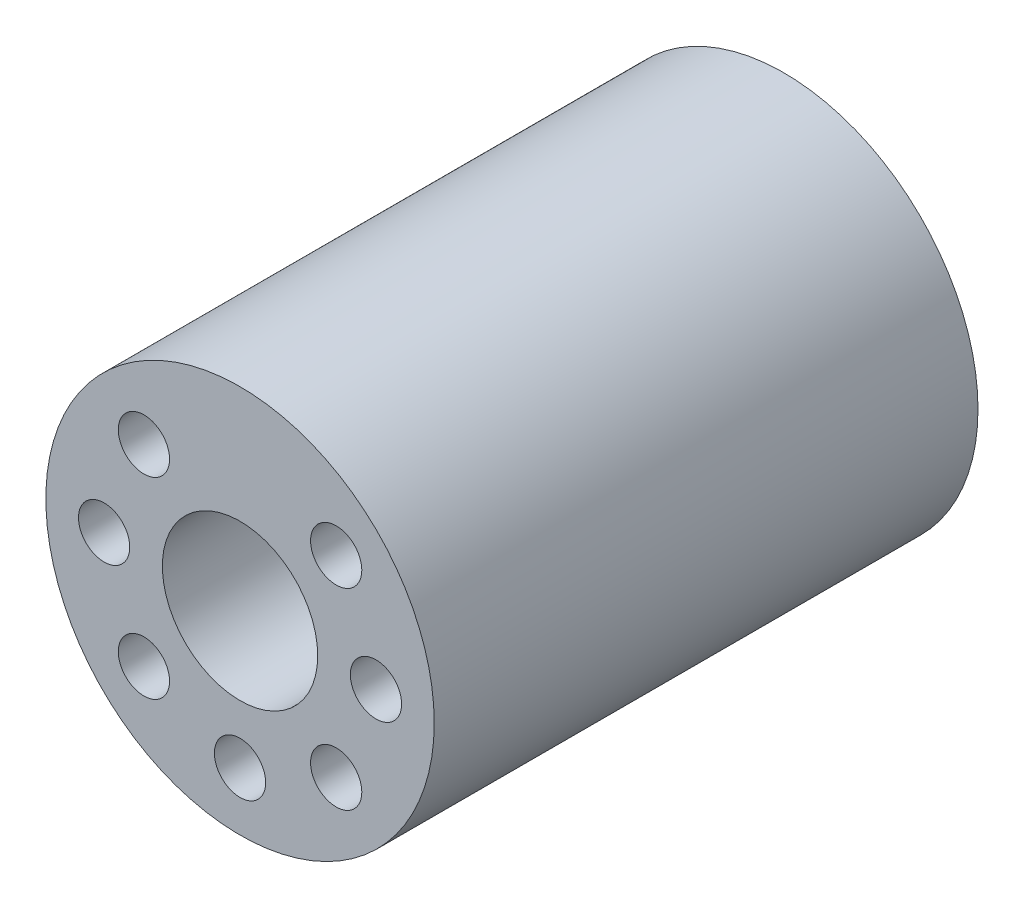
ISO-10303-21;
HEADER;
FILE_DESCRIPTION(('STEP AP214'),'2;1');
FILE_NAME('part.step','',(''),(''),'','','');
FILE_SCHEMA(('AUTOMOTIVE_DESIGN { 1 0 10303 214 1 1 1 1 }'));
ENDSEC;
DATA;
#1=APPLICATION_CONTEXT('core data for automotive mechanical design processes');
#2=APPLICATION_PROTOCOL_DEFINITION('international standard','automotive_design',2000,#1);
#3=PRODUCT_CONTEXT('',#1,'mechanical');
#4=PRODUCT('Part','Part','',(#3));
#5=PRODUCT_RELATED_PRODUCT_CATEGORY('part','',(#4));
#6=PRODUCT_DEFINITION_FORMATION('','',#4);
#7=PRODUCT_DEFINITION_CONTEXT('part definition',#1,'design');
#8=PRODUCT_DEFINITION('design','',#6,#7);
#9=PRODUCT_DEFINITION_SHAPE('','',#8);
#10=(LENGTH_UNIT() NAMED_UNIT(*) SI_UNIT(.MILLI.,.METRE.));
#11=(NAMED_UNIT(*) PLANE_ANGLE_UNIT() SI_UNIT($,.RADIAN.));
#12=(NAMED_UNIT(*) SI_UNIT($,.STERADIAN.) SOLID_ANGLE_UNIT());
#13=UNCERTAINTY_MEASURE_WITH_UNIT(LENGTH_MEASURE(1.E-05),#10,'distance_accuracy_value','');
#14=(GEOMETRIC_REPRESENTATION_CONTEXT(3) GLOBAL_UNCERTAINTY_ASSIGNED_CONTEXT((#13)) GLOBAL_UNIT_ASSIGNED_CONTEXT((#10,
#11,#12)) REPRESENTATION_CONTEXT('',''));
#15=CARTESIAN_POINT('',(0.,0.,0.));
#16=DIRECTION('',(0.,0.,1.));
#17=DIRECTION('',(1.,0.,0.));
#18=AXIS2_PLACEMENT_3D('',#15,#16,#17);
#19=CARTESIAN_POINT('',(0.,0.,70.));
#20=DIRECTION('',(0.,0.,1.));
#21=DIRECTION('',(1.,0.,0.));
#22=AXIS2_PLACEMENT_3D('',#19,#20,#21);
#23=PLANE('',#22);
#24=CARTESIAN_POINT('',(17.5,0.,70.));
#25=DIRECTION('',(0.,0.,1.));
#26=DIRECTION('',(1.,0.,0.));
#27=AXIS2_PLACEMENT_3D('',#24,#25,#26);
#28=CIRCLE('',#27,3.3);
#29=CARTESIAN_POINT('',(20.8,0.,70.));
#30=VERTEX_POINT('',#29);
#31=EDGE_CURVE('E59',#30,#30,#28,.T.);
#32=ORIENTED_EDGE('',*,*,#31,.F.);
#33=EDGE_LOOP('',(#32));
#34=FACE_BOUND('',#33,.T.);
#35=CARTESIAN_POINT('',(12.3743686707645,-12.3743686707646,70.));
#36=DIRECTION('',(0.,0.,1.));
#37=DIRECTION('',(1.,0.,0.));
#38=AXIS2_PLACEMENT_3D('',#35,#36,#37);
#39=CIRCLE('',#38,3.3);
#40=CARTESIAN_POINT('',(15.6743686707645,-12.3743686707646,70.));
#41=VERTEX_POINT('',#40);
#42=EDGE_CURVE('E78',#41,#41,#39,.T.);
#43=ORIENTED_EDGE('',*,*,#42,.F.);
#44=EDGE_LOOP('',(#43));
#45=FACE_BOUND('',#44,.T.);
#46=CARTESIAN_POINT('',(-1.2220184685951E-13,-17.5,70.));
#47=DIRECTION('',(0.,0.,1.));
#48=DIRECTION('',(1.,0.,0.));
#49=AXIS2_PLACEMENT_3D('',#46,#47,#48);
#50=CIRCLE('',#49,3.3);
#51=CARTESIAN_POINT('',(3.29999999999988,-17.5,70.));
#52=VERTEX_POINT('',#51);
#53=EDGE_CURVE('E72',#52,#52,#50,.T.);
#54=ORIENTED_EDGE('',*,*,#53,.F.);
#55=EDGE_LOOP('',(#54));
#56=FACE_BOUND('',#55,.T.);
#57=CARTESIAN_POINT('',(-12.3743686707647,-12.3743686707645,70.));
#58=DIRECTION('',(0.,0.,1.));
#59=DIRECTION('',(1.,0.,0.));
#60=AXIS2_PLACEMENT_3D('',#57,#58,#59);
#61=CIRCLE('',#60,3.3);
#62=CARTESIAN_POINT('',(-9.07436867076469,-12.3743686707645,70.));
#63=VERTEX_POINT('',#62);
#64=EDGE_CURVE('E65',#63,#63,#61,.T.);
#65=ORIENTED_EDGE('',*,*,#64,.F.);
#66=EDGE_LOOP('',(#65));
#67=FACE_BOUND('',#66,.T.);
#68=CARTESIAN_POINT('',(-17.5,1.83302770289264E-13,70.));
#69=DIRECTION('',(0.,0.,1.));
#70=DIRECTION('',(1.,0.,0.));
#71=AXIS2_PLACEMENT_3D('',#68,#69,#70);
#72=CIRCLE('',#71,3.3);
#73=CARTESIAN_POINT('',(-14.2,1.83302770289264E-13,70.));
#74=VERTEX_POINT('',#73);
#75=EDGE_CURVE('E66',#74,#74,#72,.T.);
#76=ORIENTED_EDGE('',*,*,#75,.F.);
#77=EDGE_LOOP('',(#76));
#78=FACE_BOUND('',#77,.T.);
#79=CARTESIAN_POINT('',(-12.3743686707644,12.3743686707647,70.));
#80=DIRECTION('',(0.,0.,1.));
#81=DIRECTION('',(1.,0.,0.));
#82=AXIS2_PLACEMENT_3D('',#79,#80,#81);
#83=CIRCLE('',#82,3.3);
#84=CARTESIAN_POINT('',(-9.07436867076443,12.3743686707647,70.));
#85=VERTEX_POINT('',#84);
#86=EDGE_CURVE('E89',#85,#85,#83,.T.);
#87=ORIENTED_EDGE('',*,*,#86,.F.);
#88=EDGE_LOOP('',(#87));
#89=FACE_BOUND('',#88,.T.);
#90=CARTESIAN_POINT('',(12.3743686707646,12.3743686707646,70.));
#91=DIRECTION('',(0.,0.,1.));
#92=DIRECTION('',(1.,0.,0.));
#93=AXIS2_PLACEMENT_3D('',#90,#91,#92);
#94=CIRCLE('',#93,3.3);
#95=CARTESIAN_POINT('',(15.6743686707646,12.3743686707646,70.));
#96=VERTEX_POINT('',#95);
#97=EDGE_CURVE('E56',#96,#96,#94,.T.);
#98=ORIENTED_EDGE('',*,*,#97,.F.);
#99=EDGE_LOOP('',(#98));
#100=FACE_BOUND('',#99,.T.);
#101=CARTESIAN_POINT('',(0.,0.,70.));
#102=DIRECTION('',(0.,0.,1.));
#103=DIRECTION('',(1.,0.,0.));
#104=AXIS2_PLACEMENT_3D('',#101,#102,#103);
#105=CIRCLE('',#104,25.);
#106=CARTESIAN_POINT('',(25.,0.,70.));
#107=VERTEX_POINT('',#106);
#108=EDGE_CURVE('E10',#107,#107,#105,.T.);
#109=ORIENTED_EDGE('',*,*,#108,.T.);
#110=EDGE_LOOP('',(#109));
#111=FACE_BOUND('',#110,.T.);
#112=CARTESIAN_POINT('',(0.,0.,70.));
#113=DIRECTION('',(0.,0.,1.));
#114=DIRECTION('',(1.,0.,0.));
#115=AXIS2_PLACEMENT_3D('',#112,#113,#114);
#116=CIRCLE('',#115,10.);
#117=CARTESIAN_POINT('',(10.,0.,70.));
#118=VERTEX_POINT('',#117);
#119=EDGE_CURVE('E48',#118,#118,#116,.T.);
#120=ORIENTED_EDGE('',*,*,#119,.F.);
#121=EDGE_LOOP('',(#120));
#122=FACE_BOUND('',#121,.T.);
#123=ADVANCED_FACE('F37',(#34,#45,#56,#67,#78,#89,#100,#111,#122),#23,.T.);
#124=CARTESIAN_POINT('',(0.,0.,0.));
#125=DIRECTION('',(0.,0.,1.));
#126=DIRECTION('',(1.,0.,0.));
#127=AXIS2_PLACEMENT_3D('',#124,#125,#126);
#128=PLANE('',#127);
#129=CARTESIAN_POINT('',(12.3743686707644,12.3743686707647,0.));
#130=DIRECTION('',(0.,0.,-1.));
#131=DIRECTION('',(-1.,0.,0.));
#132=AXIS2_PLACEMENT_3D('',#129,#130,#131);
#133=CIRCLE('',#132,3.3);
#134=CARTESIAN_POINT('',(9.07436867076443,12.3743686707647,0.));
#135=VERTEX_POINT('',#134);
#136=EDGE_CURVE('E107',#135,#135,#133,.T.);
#137=ORIENTED_EDGE('',*,*,#136,.F.);
#138=EDGE_LOOP('',(#137));
#139=FACE_BOUND('',#138,.T.);
#140=CARTESIAN_POINT('',(17.5,1.83302770289264E-13,0.));
#141=DIRECTION('',(0.,0.,-1.));
#142=DIRECTION('',(-1.,0.,0.));
#143=AXIS2_PLACEMENT_3D('',#140,#141,#142);
#144=CIRCLE('',#143,3.3);
#145=CARTESIAN_POINT('',(14.2,1.83302770289264E-13,0.));
#146=VERTEX_POINT('',#145);
#147=EDGE_CURVE('E113',#146,#146,#144,.T.);
#148=ORIENTED_EDGE('',*,*,#147,.F.);
#149=EDGE_LOOP('',(#148));
#150=FACE_BOUND('',#149,.T.);
#151=CARTESIAN_POINT('',(12.3743686707647,-12.3743686707645,0.));
#152=DIRECTION('',(0.,0.,-1.));
#153=DIRECTION('',(-1.,0.,0.));
#154=AXIS2_PLACEMENT_3D('',#151,#152,#153);
#155=CIRCLE('',#154,3.3);
#156=CARTESIAN_POINT('',(9.07436867076469,-12.3743686707645,0.));
#157=VERTEX_POINT('',#156);
#158=EDGE_CURVE('E119',#157,#157,#155,.T.);
#159=ORIENTED_EDGE('',*,*,#158,.F.);
#160=EDGE_LOOP('',(#159));
#161=FACE_BOUND('',#160,.T.);
#162=CARTESIAN_POINT('',(1.2220184685951E-13,-17.5,0.));
#163=DIRECTION('',(0.,0.,-1.));
#164=DIRECTION('',(-1.,0.,0.));
#165=AXIS2_PLACEMENT_3D('',#162,#163,#164);
#166=CIRCLE('',#165,3.3);
#167=CARTESIAN_POINT('',(-3.29999999999988,-17.5,0.));
#168=VERTEX_POINT('',#167);
#169=EDGE_CURVE('E125',#168,#168,#166,.T.);
#170=ORIENTED_EDGE('',*,*,#169,.F.);
#171=EDGE_LOOP('',(#170));
#172=FACE_BOUND('',#171,.T.);
#173=CARTESIAN_POINT('',(-12.3743686707645,-12.3743686707646,0.));
#174=DIRECTION('',(0.,0.,-1.));
#175=DIRECTION('',(-1.,0.,0.));
#176=AXIS2_PLACEMENT_3D('',#173,#174,#175);
#177=CIRCLE('',#176,3.3);
#178=CARTESIAN_POINT('',(-15.6743686707645,-12.3743686707646,0.));
#179=VERTEX_POINT('',#178);
#180=EDGE_CURVE('E131',#179,#179,#177,.T.);
#181=ORIENTED_EDGE('',*,*,#180,.F.);
#182=EDGE_LOOP('',(#181));
#183=FACE_BOUND('',#182,.T.);
#184=CARTESIAN_POINT('',(-17.5,0.,0.));
#185=DIRECTION('',(0.,0.,-1.));
#186=DIRECTION('',(-1.,0.,0.));
#187=AXIS2_PLACEMENT_3D('',#184,#185,#186);
#188=CIRCLE('',#187,3.3);
#189=CARTESIAN_POINT('',(-20.8,0.,0.));
#190=VERTEX_POINT('',#189);
#191=EDGE_CURVE('E137',#190,#190,#188,.T.);
#192=ORIENTED_EDGE('',*,*,#191,.F.);
#193=EDGE_LOOP('',(#192));
#194=FACE_BOUND('',#193,.T.);
#195=CARTESIAN_POINT('',(-12.3743686707646,12.3743686707646,0.));
#196=DIRECTION('',(0.,0.,-1.));
#197=DIRECTION('',(-1.,0.,0.));
#198=AXIS2_PLACEMENT_3D('',#195,#196,#197);
#199=CIRCLE('',#198,3.3);
#200=CARTESIAN_POINT('',(-15.6743686707646,12.3743686707646,0.));
#201=VERTEX_POINT('',#200);
#202=EDGE_CURVE('E101',#201,#201,#199,.T.);
#203=ORIENTED_EDGE('',*,*,#202,.F.);
#204=EDGE_LOOP('',(#203));
#205=FACE_BOUND('',#204,.T.);
#206=CARTESIAN_POINT('',(0.,17.5,0.));
#207=DIRECTION('',(0.,0.,-1.));
#208=DIRECTION('',(-1.,0.,0.));
#209=AXIS2_PLACEMENT_3D('',#206,#207,#208);
#210=CIRCLE('',#209,3.3);
#211=CARTESIAN_POINT('',(-3.3,17.5,0.));
#212=VERTEX_POINT('',#211);
#213=EDGE_CURVE('E98',#212,#212,#210,.T.);
#214=ORIENTED_EDGE('',*,*,#213,.F.);
#215=EDGE_LOOP('',(#214));
#216=FACE_BOUND('',#215,.T.);
#217=CARTESIAN_POINT('',(0.,0.,0.));
#218=DIRECTION('',(0.,0.,1.));
#219=DIRECTION('',(1.,0.,0.));
#220=AXIS2_PLACEMENT_3D('',#217,#218,#219);
#221=CIRCLE('',#220,25.);
#222=CARTESIAN_POINT('',(25.,0.,0.));
#223=VERTEX_POINT('',#222);
#224=EDGE_CURVE('E41',#223,#223,#221,.T.);
#225=ORIENTED_EDGE('',*,*,#224,.F.);
#226=EDGE_LOOP('',(#225));
#227=FACE_BOUND('',#226,.T.);
#228=CARTESIAN_POINT('',(0.,0.,0.));
#229=DIRECTION('',(0.,0.,1.));
#230=DIRECTION('',(1.,0.,0.));
#231=AXIS2_PLACEMENT_3D('',#228,#229,#230);
#232=CIRCLE('',#231,10.);
#233=CARTESIAN_POINT('',(10.,0.,0.));
#234=VERTEX_POINT('',#233);
#235=EDGE_CURVE('E50',#234,#234,#232,.T.);
#236=ORIENTED_EDGE('',*,*,#235,.T.);
#237=EDGE_LOOP('',(#236));
#238=FACE_BOUND('',#237,.T.);
#239=ADVANCED_FACE('F148',(#139,#150,#161,#172,#183,#194,#205,#216,#227,#238),#128,.F.);
#240=CARTESIAN_POINT('',(0.,0.,70.));
#241=DIRECTION('',(0.,0.,-1.));
#242=DIRECTION('',(-1.,0.,0.));
#243=AXIS2_PLACEMENT_3D('',#240,#241,#242);
#244=CYLINDRICAL_SURFACE('',#243,25.);
#245=ORIENTED_EDGE('',*,*,#108,.F.);
#246=EDGE_LOOP('',(#245));
#247=FACE_BOUND('',#246,.T.);
#248=ORIENTED_EDGE('',*,*,#224,.T.);
#249=EDGE_LOOP('',(#248));
#250=FACE_BOUND('',#249,.T.);
#251=ADVANCED_FACE('F39',(#247,#250),#244,.T.);
#252=CARTESIAN_POINT('',(0.,0.,70.));
#253=DIRECTION('',(0.,0.,-1.));
#254=DIRECTION('',(-1.,0.,0.));
#255=AXIS2_PLACEMENT_3D('',#252,#253,#254);
#256=CYLINDRICAL_SURFACE('',#255,10.);
#257=ORIENTED_EDGE('',*,*,#119,.T.);
#258=EDGE_LOOP('',(#257));
#259=FACE_BOUND('',#258,.T.);
#260=ORIENTED_EDGE('',*,*,#235,.F.);
#261=EDGE_LOOP('',(#260));
#262=FACE_BOUND('',#261,.T.);
#263=ADVANCED_FACE('F158',(#259,#262),#256,.F.);
#264=CARTESIAN_POINT('',(12.3743686707646,12.3743686707646,50.));
#265=DIRECTION('',(0.,0.,1.));
#266=DIRECTION('',(1.,0.,0.));
#267=AXIS2_PLACEMENT_3D('',#264,#265,#266);
#268=CYLINDRICAL_SURFACE('',#267,3.3);
#269=CARTESIAN_POINT('',(12.3743686707646,12.3743686707646,50.));
#270=DIRECTION('',(0.,0.,1.));
#271=DIRECTION('',(1.,0.,0.));
#272=AXIS2_PLACEMENT_3D('',#269,#270,#271);
#273=CIRCLE('',#272,3.3);
#274=CARTESIAN_POINT('',(15.6743686707646,12.3743686707646,50.));
#275=VERTEX_POINT('',#274);
#276=EDGE_CURVE('E53',#275,#275,#273,.T.);
#277=ORIENTED_EDGE('',*,*,#276,.F.);
#278=EDGE_LOOP('',(#277));
#279=FACE_BOUND('',#278,.T.);
#280=ORIENTED_EDGE('',*,*,#97,.T.);
#281=EDGE_LOOP('',(#280));
#282=FACE_BOUND('',#281,.T.);
#283=ADVANCED_FACE('F160',(#279,#282),#268,.F.);
#284=CARTESIAN_POINT('',(12.3743686707646,12.3743686707646,50.));
#285=DIRECTION('',(0.,0.,1.));
#286=DIRECTION('',(1.,0.,0.));
#287=AXIS2_PLACEMENT_3D('',#284,#285,#286);
#288=PLANE('',#287);
#289=ORIENTED_EDGE('',*,*,#276,.T.);
#290=EDGE_LOOP('',(#289));
#291=FACE_BOUND('',#290,.T.);
#292=ADVANCED_FACE('F168',(#291),#288,.T.);
#293=CARTESIAN_POINT('',(-12.3743686707644,12.3743686707647,50.));
#294=DIRECTION('',(0.,0.,1.));
#295=DIRECTION('',(1.,0.,0.));
#296=AXIS2_PLACEMENT_3D('',#293,#294,#295);
#297=CYLINDRICAL_SURFACE('',#296,3.3);
#298=CARTESIAN_POINT('',(-12.3743686707644,12.3743686707647,50.));
#299=DIRECTION('',(0.,0.,1.));
#300=DIRECTION('',(1.,0.,0.));
#301=AXIS2_PLACEMENT_3D('',#298,#299,#300);
#302=CIRCLE('',#301,3.3);
#303=CARTESIAN_POINT('',(-9.07436867076443,12.3743686707647,50.));
#304=VERTEX_POINT('',#303);
#305=EDGE_CURVE('E86',#304,#304,#302,.T.);
#306=ORIENTED_EDGE('',*,*,#305,.F.);
#307=EDGE_LOOP('',(#306));
#308=FACE_BOUND('',#307,.T.);
#309=ORIENTED_EDGE('',*,*,#86,.T.);
#310=EDGE_LOOP('',(#309));
#311=FACE_BOUND('',#310,.T.);
#312=ADVANCED_FACE('F193',(#308,#311),#297,.F.);
#313=CARTESIAN_POINT('',(-12.3743686707644,12.3743686707647,50.));
#314=DIRECTION('',(0.,0.,1.));
#315=DIRECTION('',(1.,0.,0.));
#316=AXIS2_PLACEMENT_3D('',#313,#314,#315);
#317=PLANE('',#316);
#318=ORIENTED_EDGE('',*,*,#305,.T.);
#319=EDGE_LOOP('',(#318));
#320=FACE_BOUND('',#319,.T.);
#321=ADVANCED_FACE('F195',(#320),#317,.T.);
#322=CARTESIAN_POINT('',(-17.5,1.83302770289264E-13,50.));
#323=DIRECTION('',(0.,0.,1.));
#324=DIRECTION('',(1.,0.,0.));
#325=AXIS2_PLACEMENT_3D('',#322,#323,#324);
#326=CYLINDRICAL_SURFACE('',#325,3.3);
#327=CARTESIAN_POINT('',(-17.5,1.83302770289264E-13,50.));
#328=DIRECTION('',(0.,0.,1.));
#329=DIRECTION('',(1.,0.,0.));
#330=AXIS2_PLACEMENT_3D('',#327,#328,#329);
#331=CIRCLE('',#330,3.3);
#332=CARTESIAN_POINT('',(-14.2,1.83302770289264E-13,50.));
#333=VERTEX_POINT('',#332);
#334=EDGE_CURVE('E93',#333,#333,#331,.T.);
#335=ORIENTED_EDGE('',*,*,#334,.F.);
#336=EDGE_LOOP('',(#335));
#337=FACE_BOUND('',#336,.T.);
#338=ORIENTED_EDGE('',*,*,#75,.T.);
#339=EDGE_LOOP('',(#338));
#340=FACE_BOUND('',#339,.T.);
#341=ADVANCED_FACE('F202',(#337,#340),#326,.F.);
#342=CARTESIAN_POINT('',(-17.5,1.83302770289264E-13,50.));
#343=DIRECTION('',(0.,0.,1.));
#344=DIRECTION('',(1.,0.,0.));
#345=AXIS2_PLACEMENT_3D('',#342,#343,#344);
#346=PLANE('',#345);
#347=ORIENTED_EDGE('',*,*,#334,.T.);
#348=EDGE_LOOP('',(#347));
#349=FACE_BOUND('',#348,.T.);
#350=ADVANCED_FACE('F209',(#349),#346,.T.);
#351=CARTESIAN_POINT('',(-12.3743686707647,-12.3743686707645,50.));
#352=DIRECTION('',(0.,0.,1.));
#353=DIRECTION('',(1.,0.,0.));
#354=AXIS2_PLACEMENT_3D('',#351,#352,#353);
#355=CYLINDRICAL_SURFACE('',#354,3.3);
#356=CARTESIAN_POINT('',(-12.3743686707647,-12.3743686707645,50.));
#357=DIRECTION('',(0.,0.,1.));
#358=DIRECTION('',(1.,0.,0.));
#359=AXIS2_PLACEMENT_3D('',#356,#357,#358);
#360=CIRCLE('',#359,3.3);
#361=CARTESIAN_POINT('',(-9.07436867076469,-12.3743686707645,50.));
#362=VERTEX_POINT('',#361);
#363=EDGE_CURVE('E62',#362,#362,#360,.T.);
#364=ORIENTED_EDGE('',*,*,#363,.F.);
#365=EDGE_LOOP('',(#364));
#366=FACE_BOUND('',#365,.T.);
#367=ORIENTED_EDGE('',*,*,#64,.T.);
#368=EDGE_LOOP('',(#367));
#369=FACE_BOUND('',#368,.T.);
#370=ADVANCED_FACE('F238',(#366,#369),#355,.F.);
#371=CARTESIAN_POINT('',(-12.3743686707647,-12.3743686707645,50.));
#372=DIRECTION('',(0.,0.,1.));
#373=DIRECTION('',(1.,0.,0.));
#374=AXIS2_PLACEMENT_3D('',#371,#372,#373);
#375=PLANE('',#374);
#376=ORIENTED_EDGE('',*,*,#363,.T.);
#377=EDGE_LOOP('',(#376));
#378=FACE_BOUND('',#377,.T.);
#379=ADVANCED_FACE('F233',(#378),#375,.T.);
#380=CARTESIAN_POINT('',(-1.2220184685951E-13,-17.5,50.));
#381=DIRECTION('',(0.,0.,1.));
#382=DIRECTION('',(1.,0.,0.));
#383=AXIS2_PLACEMENT_3D('',#380,#381,#382);
#384=CYLINDRICAL_SURFACE('',#383,3.3);
#385=CARTESIAN_POINT('',(-1.2220184685951E-13,-17.5,50.));
#386=DIRECTION('',(0.,0.,1.));
#387=DIRECTION('',(1.,0.,0.));
#388=AXIS2_PLACEMENT_3D('',#385,#386,#387);
#389=CIRCLE('',#388,3.3);
#390=CARTESIAN_POINT('',(3.29999999999988,-17.5,50.));
#391=VERTEX_POINT('',#390);
#392=EDGE_CURVE('E69',#391,#391,#389,.T.);
#393=ORIENTED_EDGE('',*,*,#392,.F.);
#394=EDGE_LOOP('',(#393));
#395=FACE_BOUND('',#394,.T.);
#396=ORIENTED_EDGE('',*,*,#53,.T.);
#397=EDGE_LOOP('',(#396));
#398=FACE_BOUND('',#397,.T.);
#399=ADVANCED_FACE('F230',(#395,#398),#384,.F.);
#400=CARTESIAN_POINT('',(-1.2220184685951E-13,-17.5,50.));
#401=DIRECTION('',(0.,0.,1.));
#402=DIRECTION('',(1.,0.,0.));
#403=AXIS2_PLACEMENT_3D('',#400,#401,#402);
#404=PLANE('',#403);
#405=ORIENTED_EDGE('',*,*,#392,.T.);
#406=EDGE_LOOP('',(#405));
#407=FACE_BOUND('',#406,.T.);
#408=ADVANCED_FACE('F225',(#407),#404,.T.);
#409=CARTESIAN_POINT('',(12.3743686707645,-12.3743686707646,50.));
#410=DIRECTION('',(0.,0.,1.));
#411=DIRECTION('',(1.,0.,0.));
#412=AXIS2_PLACEMENT_3D('',#409,#410,#411);
#413=CYLINDRICAL_SURFACE('',#412,3.3);
#414=CARTESIAN_POINT('',(12.3743686707645,-12.3743686707646,50.));
#415=DIRECTION('',(0.,0.,1.));
#416=DIRECTION('',(1.,0.,0.));
#417=AXIS2_PLACEMENT_3D('',#414,#415,#416);
#418=CIRCLE('',#417,3.3);
#419=CARTESIAN_POINT('',(15.6743686707645,-12.3743686707646,50.));
#420=VERTEX_POINT('',#419);
#421=EDGE_CURVE('E75',#420,#420,#418,.T.);
#422=ORIENTED_EDGE('',*,*,#421,.F.);
#423=EDGE_LOOP('',(#422));
#424=FACE_BOUND('',#423,.T.);
#425=ORIENTED_EDGE('',*,*,#42,.T.);
#426=EDGE_LOOP('',(#425));
#427=FACE_BOUND('',#426,.T.);
#428=ADVANCED_FACE('F222',(#424,#427),#413,.F.);
#429=CARTESIAN_POINT('',(12.3743686707645,-12.3743686707646,50.));
#430=DIRECTION('',(0.,0.,1.));
#431=DIRECTION('',(1.,0.,0.));
#432=AXIS2_PLACEMENT_3D('',#429,#430,#431);
#433=PLANE('',#432);
#434=ORIENTED_EDGE('',*,*,#421,.T.);
#435=EDGE_LOOP('',(#434));
#436=FACE_BOUND('',#435,.T.);
#437=ADVANCED_FACE('F216',(#436),#433,.T.);
#438=CARTESIAN_POINT('',(17.5,0.,50.));
#439=DIRECTION('',(0.,0.,1.));
#440=DIRECTION('',(1.,0.,0.));
#441=AXIS2_PLACEMENT_3D('',#438,#439,#440);
#442=CYLINDRICAL_SURFACE('',#441,3.3);
#443=CARTESIAN_POINT('',(17.5,0.,50.));
#444=DIRECTION('',(0.,0.,1.));
#445=DIRECTION('',(1.,0.,0.));
#446=AXIS2_PLACEMENT_3D('',#443,#444,#445);
#447=CIRCLE('',#446,3.3);
#448=CARTESIAN_POINT('',(20.8,0.,50.));
#449=VERTEX_POINT('',#448);
#450=EDGE_CURVE('E81',#449,#449,#447,.T.);
#451=ORIENTED_EDGE('',*,*,#450,.F.);
#452=EDGE_LOOP('',(#451));
#453=FACE_BOUND('',#452,.T.);
#454=ORIENTED_EDGE('',*,*,#31,.T.);
#455=EDGE_LOOP('',(#454));
#456=FACE_BOUND('',#455,.T.);
#457=ADVANCED_FACE('F212',(#453,#456),#442,.F.);
#458=CARTESIAN_POINT('',(17.5,0.,50.));
#459=DIRECTION('',(0.,0.,1.));
#460=DIRECTION('',(1.,0.,0.));
#461=AXIS2_PLACEMENT_3D('',#458,#459,#460);
#462=PLANE('',#461);
#463=ORIENTED_EDGE('',*,*,#450,.T.);
#464=EDGE_LOOP('',(#463));
#465=FACE_BOUND('',#464,.T.);
#466=ADVANCED_FACE('F215',(#465),#462,.T.);
#467=CARTESIAN_POINT('',(0.,17.5,20.));
#468=DIRECTION('',(0.,0.,-1.));
#469=DIRECTION('',(-1.,0.,0.));
#470=AXIS2_PLACEMENT_3D('',#467,#468,#469);
#471=CYLINDRICAL_SURFACE('',#470,3.3);
#472=CARTESIAN_POINT('',(0.,17.5,20.));
#473=DIRECTION('',(0.,0.,-1.));
#474=DIRECTION('',(-1.,0.,0.));
#475=AXIS2_PLACEMENT_3D('',#472,#473,#474);
#476=CIRCLE('',#475,3.3);
#477=CARTESIAN_POINT('',(-3.3,17.5,20.));
#478=VERTEX_POINT('',#477);
#479=EDGE_CURVE('E90',#478,#478,#476,.T.);
#480=ORIENTED_EDGE('',*,*,#479,.F.);
#481=EDGE_LOOP('',(#480));
#482=FACE_BOUND('',#481,.T.);
#483=ORIENTED_EDGE('',*,*,#213,.T.);
#484=EDGE_LOOP('',(#483));
#485=FACE_BOUND('',#484,.T.);
#486=ADVANCED_FACE('F220',(#482,#485),#471,.F.);
#487=CARTESIAN_POINT('',(0.,0.,20.));
#488=DIRECTION('',(0.,0.,-1.));
#489=DIRECTION('',(-1.,0.,0.));
#490=AXIS2_PLACEMENT_3D('',#487,#488,#489);
#491=PLANE('',#490);
#492=ORIENTED_EDGE('',*,*,#479,.T.);
#493=EDGE_LOOP('',(#492));
#494=FACE_BOUND('',#493,.T.);
#495=ADVANCED_FACE('F294',(#494),#491,.T.);
#496=CARTESIAN_POINT('',(-12.3743686707646,12.3743686707646,20.));
#497=DIRECTION('',(0.,0.,-1.));
#498=DIRECTION('',(-1.,0.,0.));
#499=AXIS2_PLACEMENT_3D('',#496,#497,#498);
#500=CYLINDRICAL_SURFACE('',#499,3.3);
#501=CARTESIAN_POINT('',(-12.3743686707646,12.3743686707646,20.));
#502=DIRECTION('',(0.,0.,-1.));
#503=DIRECTION('',(-1.,0.,0.));
#504=AXIS2_PLACEMENT_3D('',#501,#502,#503);
#505=CIRCLE('',#504,3.3);
#506=CARTESIAN_POINT('',(-15.6743686707646,12.3743686707646,20.));
#507=VERTEX_POINT('',#506);
#508=EDGE_CURVE('E140',#507,#507,#505,.T.);
#509=ORIENTED_EDGE('',*,*,#508,.F.);
#510=EDGE_LOOP('',(#509));
#511=FACE_BOUND('',#510,.T.);
#512=ORIENTED_EDGE('',*,*,#202,.T.);
#513=EDGE_LOOP('',(#512));
#514=FACE_BOUND('',#513,.T.);
#515=ADVANCED_FACE('F146',(#511,#514),#500,.F.);
#516=CARTESIAN_POINT('',(0.,0.,20.));
#517=DIRECTION('',(0.,0.,-1.));
#518=DIRECTION('',(-1.,0.,0.));
#519=AXIS2_PLACEMENT_3D('',#516,#517,#518);
#520=PLANE('',#519);
#521=ORIENTED_EDGE('',*,*,#508,.T.);
#522=EDGE_LOOP('',(#521));
#523=FACE_BOUND('',#522,.T.);
#524=ADVANCED_FACE('F311',(#523),#520,.T.);
#525=CARTESIAN_POINT('',(-17.5,0.,20.));
#526=DIRECTION('',(0.,0.,-1.));
#527=DIRECTION('',(-1.,0.,0.));
#528=AXIS2_PLACEMENT_3D('',#525,#526,#527);
#529=CYLINDRICAL_SURFACE('',#528,3.3);
#530=CARTESIAN_POINT('',(-17.5,0.,20.));
#531=DIRECTION('',(0.,0.,-1.));
#532=DIRECTION('',(-1.,0.,0.));
#533=AXIS2_PLACEMENT_3D('',#530,#531,#532);
#534=CIRCLE('',#533,3.3);
#535=CARTESIAN_POINT('',(-20.8,0.,20.));
#536=VERTEX_POINT('',#535);
#537=EDGE_CURVE('E134',#536,#536,#534,.T.);
#538=ORIENTED_EDGE('',*,*,#537,.F.);
#539=EDGE_LOOP('',(#538));
#540=FACE_BOUND('',#539,.T.);
#541=ORIENTED_EDGE('',*,*,#191,.T.);
#542=EDGE_LOOP('',(#541));
#543=FACE_BOUND('',#542,.T.);
#544=ADVANCED_FACE('F320',(#540,#543),#529,.F.);
#545=CARTESIAN_POINT('',(0.,0.,20.));
#546=DIRECTION('',(0.,0.,-1.));
#547=DIRECTION('',(-1.,0.,0.));
#548=AXIS2_PLACEMENT_3D('',#545,#546,#547);
#549=PLANE('',#548);
#550=ORIENTED_EDGE('',*,*,#537,.T.);
#551=EDGE_LOOP('',(#550));
#552=FACE_BOUND('',#551,.T.);
#553=ADVANCED_FACE('F329',(#552),#549,.T.);
#554=CARTESIAN_POINT('',(-12.3743686707645,-12.3743686707646,20.));
#555=DIRECTION('',(0.,0.,-1.));
#556=DIRECTION('',(-1.,0.,0.));
#557=AXIS2_PLACEMENT_3D('',#554,#555,#556);
#558=CYLINDRICAL_SURFACE('',#557,3.3);
#559=CARTESIAN_POINT('',(-12.3743686707645,-12.3743686707646,20.));
#560=DIRECTION('',(0.,0.,-1.));
#561=DIRECTION('',(-1.,0.,0.));
#562=AXIS2_PLACEMENT_3D('',#559,#560,#561);
#563=CIRCLE('',#562,3.3);
#564=CARTESIAN_POINT('',(-15.6743686707645,-12.3743686707646,20.));
#565=VERTEX_POINT('',#564);
#566=EDGE_CURVE('E128',#565,#565,#563,.T.);
#567=ORIENTED_EDGE('',*,*,#566,.F.);
#568=EDGE_LOOP('',(#567));
#569=FACE_BOUND('',#568,.T.);
#570=ORIENTED_EDGE('',*,*,#180,.T.);
#571=EDGE_LOOP('',(#570));
#572=FACE_BOUND('',#571,.T.);
#573=ADVANCED_FACE('F338',(#569,#572),#558,.F.);
#574=CARTESIAN_POINT('',(0.,0.,20.));
#575=DIRECTION('',(0.,0.,-1.));
#576=DIRECTION('',(-1.,0.,0.));
#577=AXIS2_PLACEMENT_3D('',#574,#575,#576);
#578=PLANE('',#577);
#579=ORIENTED_EDGE('',*,*,#566,.T.);
#580=EDGE_LOOP('',(#579));
#581=FACE_BOUND('',#580,.T.);
#582=ADVANCED_FACE('F347',(#581),#578,.T.);
#583=CARTESIAN_POINT('',(1.2220184685951E-13,-17.5,20.));
#584=DIRECTION('',(0.,0.,-1.));
#585=DIRECTION('',(-1.,0.,0.));
#586=AXIS2_PLACEMENT_3D('',#583,#584,#585);
#587=CYLINDRICAL_SURFACE('',#586,3.3);
#588=CARTESIAN_POINT('',(1.2220184685951E-13,-17.5,20.));
#589=DIRECTION('',(0.,0.,-1.));
#590=DIRECTION('',(-1.,0.,0.));
#591=AXIS2_PLACEMENT_3D('',#588,#589,#590);
#592=CIRCLE('',#591,3.3);
#593=CARTESIAN_POINT('',(-3.29999999999988,-17.5,20.));
#594=VERTEX_POINT('',#593);
#595=EDGE_CURVE('E122',#594,#594,#592,.T.);
#596=ORIENTED_EDGE('',*,*,#595,.F.);
#597=EDGE_LOOP('',(#596));
#598=FACE_BOUND('',#597,.T.);
#599=ORIENTED_EDGE('',*,*,#169,.T.);
#600=EDGE_LOOP('',(#599));
#601=FACE_BOUND('',#600,.T.);
#602=ADVANCED_FACE('F356',(#598,#601),#587,.F.);
#603=CARTESIAN_POINT('',(0.,0.,20.));
#604=DIRECTION('',(0.,0.,-1.));
#605=DIRECTION('',(-1.,0.,0.));
#606=AXIS2_PLACEMENT_3D('',#603,#604,#605);
#607=PLANE('',#606);
#608=ORIENTED_EDGE('',*,*,#595,.T.);
#609=EDGE_LOOP('',(#608));
#610=FACE_BOUND('',#609,.T.);
#611=ADVANCED_FACE('F365',(#610),#607,.T.);
#612=CARTESIAN_POINT('',(12.3743686707647,-12.3743686707645,20.));
#613=DIRECTION('',(0.,0.,-1.));
#614=DIRECTION('',(-1.,0.,0.));
#615=AXIS2_PLACEMENT_3D('',#612,#613,#614);
#616=CYLINDRICAL_SURFACE('',#615,3.3);
#617=CARTESIAN_POINT('',(12.3743686707647,-12.3743686707645,20.));
#618=DIRECTION('',(0.,0.,-1.));
#619=DIRECTION('',(-1.,0.,0.));
#620=AXIS2_PLACEMENT_3D('',#617,#618,#619);
#621=CIRCLE('',#620,3.3);
#622=CARTESIAN_POINT('',(9.07436867076469,-12.3743686707645,20.));
#623=VERTEX_POINT('',#622);
#624=EDGE_CURVE('E116',#623,#623,#621,.T.);
#625=ORIENTED_EDGE('',*,*,#624,.F.);
#626=EDGE_LOOP('',(#625));
#627=FACE_BOUND('',#626,.T.);
#628=ORIENTED_EDGE('',*,*,#158,.T.);
#629=EDGE_LOOP('',(#628));
#630=FACE_BOUND('',#629,.T.);
#631=ADVANCED_FACE('F374',(#627,#630),#616,.F.);
#632=CARTESIAN_POINT('',(0.,0.,20.));
#633=DIRECTION('',(0.,0.,-1.));
#634=DIRECTION('',(-1.,0.,0.));
#635=AXIS2_PLACEMENT_3D('',#632,#633,#634);
#636=PLANE('',#635);
#637=ORIENTED_EDGE('',*,*,#624,.T.);
#638=EDGE_LOOP('',(#637));
#639=FACE_BOUND('',#638,.T.);
#640=ADVANCED_FACE('F383',(#639),#636,.T.);
#641=CARTESIAN_POINT('',(17.5,1.83302770289264E-13,20.));
#642=DIRECTION('',(0.,0.,-1.));
#643=DIRECTION('',(-1.,0.,0.));
#644=AXIS2_PLACEMENT_3D('',#641,#642,#643);
#645=CYLINDRICAL_SURFACE('',#644,3.3);
#646=CARTESIAN_POINT('',(17.5,1.83302770289264E-13,20.));
#647=DIRECTION('',(0.,0.,-1.));
#648=DIRECTION('',(-1.,0.,0.));
#649=AXIS2_PLACEMENT_3D('',#646,#647,#648);
#650=CIRCLE('',#649,3.3);
#651=CARTESIAN_POINT('',(14.2,1.83302770289264E-13,20.));
#652=VERTEX_POINT('',#651);
#653=EDGE_CURVE('E110',#652,#652,#650,.T.);
#654=ORIENTED_EDGE('',*,*,#653,.F.);
#655=EDGE_LOOP('',(#654));
#656=FACE_BOUND('',#655,.T.);
#657=ORIENTED_EDGE('',*,*,#147,.T.);
#658=EDGE_LOOP('',(#657));
#659=FACE_BOUND('',#658,.T.);
#660=ADVANCED_FACE('F392',(#656,#659),#645,.F.);
#661=CARTESIAN_POINT('',(0.,0.,20.));
#662=DIRECTION('',(0.,0.,-1.));
#663=DIRECTION('',(-1.,0.,0.));
#664=AXIS2_PLACEMENT_3D('',#661,#662,#663);
#665=PLANE('',#664);
#666=ORIENTED_EDGE('',*,*,#653,.T.);
#667=EDGE_LOOP('',(#666));
#668=FACE_BOUND('',#667,.T.);
#669=ADVANCED_FACE('F401',(#668),#665,.T.);
#670=CARTESIAN_POINT('',(12.3743686707644,12.3743686707647,20.));
#671=DIRECTION('',(0.,0.,-1.));
#672=DIRECTION('',(-1.,0.,0.));
#673=AXIS2_PLACEMENT_3D('',#670,#671,#672);
#674=CYLINDRICAL_SURFACE('',#673,3.3);
#675=CARTESIAN_POINT('',(12.3743686707644,12.3743686707647,20.));
#676=DIRECTION('',(0.,0.,-1.));
#677=DIRECTION('',(-1.,0.,0.));
#678=AXIS2_PLACEMENT_3D('',#675,#676,#677);
#679=CIRCLE('',#678,3.3);
#680=CARTESIAN_POINT('',(9.07436867076443,12.3743686707647,20.));
#681=VERTEX_POINT('',#680);
#682=EDGE_CURVE('E104',#681,#681,#679,.T.);
#683=ORIENTED_EDGE('',*,*,#682,.F.);
#684=EDGE_LOOP('',(#683));
#685=FACE_BOUND('',#684,.T.);
#686=ORIENTED_EDGE('',*,*,#136,.T.);
#687=EDGE_LOOP('',(#686));
#688=FACE_BOUND('',#687,.T.);
#689=ADVANCED_FACE('F410',(#685,#688),#674,.F.);
#690=CARTESIAN_POINT('',(12.3743686707644,12.3743686707647,20.));
#691=DIRECTION('',(0.,0.,-1.));
#692=DIRECTION('',(-1.,0.,0.));
#693=AXIS2_PLACEMENT_3D('',#690,#691,#692);
#694=PLANE('',#693);
#695=ORIENTED_EDGE('',*,*,#682,.T.);
#696=EDGE_LOOP('',(#695));
#697=FACE_BOUND('',#696,.T.);
#698=ADVANCED_FACE('F419',(#697),#694,.T.);
#699=CLOSED_SHELL('',(#123,#239,#251,#263,#283,#292,#312,#321,#341,#350,#370,#379,#399,#408,
#428,#437,#457,#466,#486,#495,#515,#524,#544,#553,#573,#582,#602,#611,#631,#640,#660,#669,#689,#698));
#700=MANIFOLD_SOLID_BREP('B2',#699);
#701=ADVANCED_BREP_SHAPE_REPRESENTATION('',(#18,#700),#14);
#702=SHAPE_DEFINITION_REPRESENTATION(#9,#701);
ENDSEC;
END-ISO-10303-21;
